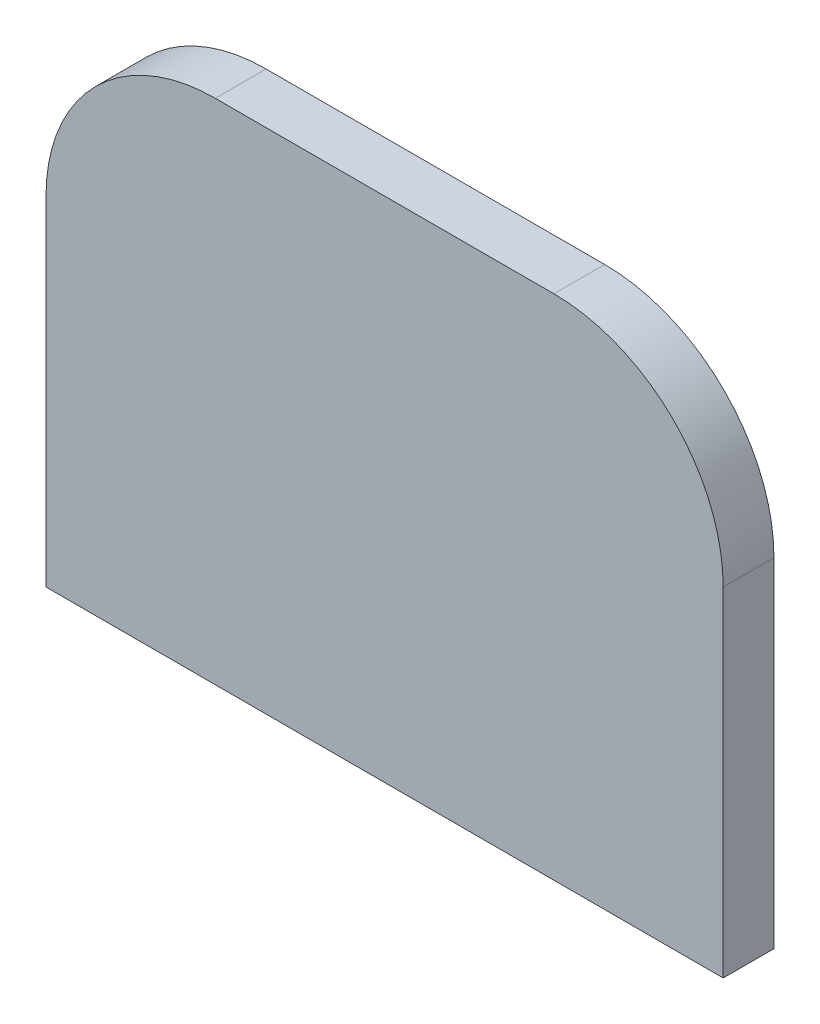
ISO-10303-21;
HEADER;
FILE_DESCRIPTION(('STEP AP214'),'2;1');
FILE_NAME('part.step','',(''),(''),'','','');
FILE_SCHEMA(('AUTOMOTIVE_DESIGN { 1 0 10303 214 1 1 1 1 }'));
ENDSEC;
DATA;
#1=APPLICATION_CONTEXT('core data for automotive mechanical design processes');
#2=APPLICATION_PROTOCOL_DEFINITION('international standard','automotive_design',2000,#1);
#3=PRODUCT_CONTEXT('',#1,'mechanical');
#4=PRODUCT('Part','Part','',(#3));
#5=PRODUCT_RELATED_PRODUCT_CATEGORY('part','',(#4));
#6=PRODUCT_DEFINITION_FORMATION('','',#4);
#7=PRODUCT_DEFINITION_CONTEXT('part definition',#1,'design');
#8=PRODUCT_DEFINITION('design','',#6,#7);
#9=PRODUCT_DEFINITION_SHAPE('','',#8);
#10=(LENGTH_UNIT() NAMED_UNIT(*) SI_UNIT(.MILLI.,.METRE.));
#11=(NAMED_UNIT(*) PLANE_ANGLE_UNIT() SI_UNIT($,.RADIAN.));
#12=(NAMED_UNIT(*) SI_UNIT($,.STERADIAN.) SOLID_ANGLE_UNIT());
#13=UNCERTAINTY_MEASURE_WITH_UNIT(LENGTH_MEASURE(1.E-05),#10,'distance_accuracy_value','');
#14=(GEOMETRIC_REPRESENTATION_CONTEXT(3) GLOBAL_UNCERTAINTY_ASSIGNED_CONTEXT((#13)) GLOBAL_UNIT_ASSIGNED_CONTEXT((#10,
#11,#12)) REPRESENTATION_CONTEXT('',''));
#15=CARTESIAN_POINT('',(0.,0.,0.));
#16=DIRECTION('',(0.,0.,1.));
#17=DIRECTION('',(1.,0.,0.));
#18=AXIS2_PLACEMENT_3D('',#15,#16,#17);
#19=CARTESIAN_POINT('',(20.,15.,3.));
#20=DIRECTION('',(-1.,0.,0.));
#21=DIRECTION('',(0.,0.,1.));
#22=AXIS2_PLACEMENT_3D('',#19,#20,#21);
#23=PLANE('',#22);
#24=DIRECTION('',(0.,1.,0.));
#25=VECTOR('',#24,1.);
#26=CARTESIAN_POINT('',(20.,15.,0.));
#27=LINE('',#26,#25);
#28=CARTESIAN_POINT('',(20.,-15.,0.));
#29=VERTEX_POINT('',#28);
#30=CARTESIAN_POINT('',(20.,5.,0.));
#31=VERTEX_POINT('',#30);
#32=EDGE_CURVE('E120',#29,#31,#27,.T.);
#33=ORIENTED_EDGE('',*,*,#32,.T.);
#34=DIRECTION('',(0.,0.,-1.));
#35=VECTOR('',#34,1.);
#36=CARTESIAN_POINT('',(20.,5.,3.));
#37=LINE('',#36,#35);
#38=CARTESIAN_POINT('',(20.,5.,3.));
#39=VERTEX_POINT('',#38);
#40=EDGE_CURVE('E64',#31,#39,#37,.F.);
#41=ORIENTED_EDGE('',*,*,#40,.T.);
#42=DIRECTION('',(0.,1.,0.));
#43=VECTOR('',#42,1.);
#44=CARTESIAN_POINT('',(20.,15.,3.));
#45=LINE('',#44,#43);
#46=CARTESIAN_POINT('',(20.,-15.,3.));
#47=VERTEX_POINT('',#46);
#48=EDGE_CURVE('E127',#47,#39,#45,.T.);
#49=ORIENTED_EDGE('',*,*,#48,.F.);
#50=DIRECTION('',(0.,0.,-1.));
#51=VECTOR('',#50,1.);
#52=CARTESIAN_POINT('',(20.,-15.,3.));
#53=LINE('',#52,#51);
#54=EDGE_CURVE('E112',#47,#29,#53,.T.);
#55=ORIENTED_EDGE('',*,*,#54,.T.);
#56=EDGE_LOOP('',(#33,#41,#49,#55));
#57=FACE_BOUND('',#56,.T.);
#58=ADVANCED_FACE('F41',(#57),#23,.F.);
#59=CARTESIAN_POINT('',(-20.,15.,3.));
#60=DIRECTION('',(0.,-1.,0.));
#61=DIRECTION('',(0.,0.,-1.));
#62=AXIS2_PLACEMENT_3D('',#59,#60,#61);
#63=PLANE('',#62);
#64=DIRECTION('',(-1.,0.,0.));
#65=VECTOR('',#64,1.);
#66=CARTESIAN_POINT('',(-20.,15.,3.));
#67=LINE('',#66,#65);
#68=CARTESIAN_POINT('',(10.,15.,3.));
#69=VERTEX_POINT('',#68);
#70=CARTESIAN_POINT('',(-10.,15.,3.));
#71=VERTEX_POINT('',#70);
#72=EDGE_CURVE('E102',#69,#71,#67,.T.);
#73=ORIENTED_EDGE('',*,*,#72,.F.);
#74=DIRECTION('',(0.,0.,-1.));
#75=VECTOR('',#74,1.);
#76=CARTESIAN_POINT('',(10.,15.,3.));
#77=LINE('',#76,#75);
#78=CARTESIAN_POINT('',(10.,15.,0.));
#79=VERTEX_POINT('',#78);
#80=EDGE_CURVE('E130',#69,#79,#77,.T.);
#81=ORIENTED_EDGE('',*,*,#80,.T.);
#82=DIRECTION('',(-1.,0.,0.));
#83=VECTOR('',#82,1.);
#84=CARTESIAN_POINT('',(-20.,15.,0.));
#85=LINE('',#84,#83);
#86=CARTESIAN_POINT('',(-10.,15.,0.));
#87=VERTEX_POINT('',#86);
#88=EDGE_CURVE('E122',#79,#87,#85,.T.);
#89=ORIENTED_EDGE('',*,*,#88,.T.);
#90=DIRECTION('',(0.,0.,-1.));
#91=VECTOR('',#90,1.);
#92=CARTESIAN_POINT('',(-10.,15.,3.));
#93=LINE('',#92,#91);
#94=EDGE_CURVE('E111',#87,#71,#93,.F.);
#95=ORIENTED_EDGE('',*,*,#94,.T.);
#96=EDGE_LOOP('',(#73,#81,#89,#95));
#97=FACE_BOUND('',#96,.T.);
#98=ADVANCED_FACE('F143',(#97),#63,.F.);
#99=CARTESIAN_POINT('',(-20.,15.,3.));
#100=DIRECTION('',(1.,0.,0.));
#101=DIRECTION('',(0.,1.,0.));
#102=AXIS2_PLACEMENT_3D('',#99,#100,#101);
#103=PLANE('',#102);
#104=DIRECTION('',(0.,-1.,0.));
#105=VECTOR('',#104,1.);
#106=CARTESIAN_POINT('',(-20.,15.,3.));
#107=LINE('',#106,#105);
#108=CARTESIAN_POINT('',(-20.,5.,3.));
#109=VERTEX_POINT('',#108);
#110=CARTESIAN_POINT('',(-20.,-15.,3.));
#111=VERTEX_POINT('',#110);
#112=EDGE_CURVE('E94',#109,#111,#107,.T.);
#113=ORIENTED_EDGE('',*,*,#112,.F.);
#114=DIRECTION('',(0.,0.,-1.));
#115=VECTOR('',#114,1.);
#116=CARTESIAN_POINT('',(-20.,5.,3.));
#117=LINE('',#116,#115);
#118=CARTESIAN_POINT('',(-20.,5.,0.));
#119=VERTEX_POINT('',#118);
#120=EDGE_CURVE('E11',#109,#119,#117,.T.);
#121=ORIENTED_EDGE('',*,*,#120,.T.);
#122=DIRECTION('',(0.,-1.,0.));
#123=VECTOR('',#122,1.);
#124=CARTESIAN_POINT('',(-20.,15.,0.));
#125=LINE('',#124,#123);
#126=CARTESIAN_POINT('',(-20.,-15.,0.));
#127=VERTEX_POINT('',#126);
#128=EDGE_CURVE('E108',#119,#127,#125,.T.);
#129=ORIENTED_EDGE('',*,*,#128,.T.);
#130=DIRECTION('',(0.,0.,-1.));
#131=VECTOR('',#130,1.);
#132=CARTESIAN_POINT('',(-20.,-15.,3.));
#133=LINE('',#132,#131);
#134=EDGE_CURVE('E105',#111,#127,#133,.T.);
#135=ORIENTED_EDGE('',*,*,#134,.F.);
#136=EDGE_LOOP('',(#113,#121,#129,#135));
#137=FACE_BOUND('',#136,.T.);
#138=ADVANCED_FACE('F106',(#137),#103,.F.);
#139=CARTESIAN_POINT('',(-20.,-15.,3.));
#140=DIRECTION('',(0.,1.,0.));
#141=DIRECTION('',(0.,0.,1.));
#142=AXIS2_PLACEMENT_3D('',#139,#140,#141);
#143=PLANE('',#142);
#144=DIRECTION('',(1.,0.,0.));
#145=VECTOR('',#144,1.);
#146=CARTESIAN_POINT('',(-20.,-15.,0.));
#147=LINE('',#146,#145);
#148=EDGE_CURVE('E126',#127,#29,#147,.T.);
#149=ORIENTED_EDGE('',*,*,#148,.T.);
#150=ORIENTED_EDGE('',*,*,#54,.F.);
#151=DIRECTION('',(1.,0.,0.));
#152=VECTOR('',#151,1.);
#153=CARTESIAN_POINT('',(-20.,-15.,3.));
#154=LINE('',#153,#152);
#155=EDGE_CURVE('E98',#111,#47,#154,.T.);
#156=ORIENTED_EDGE('',*,*,#155,.F.);
#157=ORIENTED_EDGE('',*,*,#134,.T.);
#158=EDGE_LOOP('',(#149,#150,#156,#157));
#159=FACE_BOUND('',#158,.T.);
#160=ADVANCED_FACE('F114',(#159),#143,.F.);
#161=CARTESIAN_POINT('',(0.,0.,3.));
#162=DIRECTION('',(0.,0.,1.));
#163=DIRECTION('',(1.,0.,0.));
#164=AXIS2_PLACEMENT_3D('',#161,#162,#163);
#165=PLANE('',#164);
#166=ORIENTED_EDGE('',*,*,#48,.T.);
#167=CARTESIAN_POINT('',(10.,5.,3.));
#168=DIRECTION('',(0.,0.,1.));
#169=DIRECTION('',(1.,0.,0.));
#170=AXIS2_PLACEMENT_3D('',#167,#168,#169);
#171=CIRCLE('',#170,10.);
#172=EDGE_CURVE('E49',#39,#69,#171,.T.);
#173=ORIENTED_EDGE('',*,*,#172,.T.);
#174=ORIENTED_EDGE('',*,*,#72,.T.);
#175=CARTESIAN_POINT('',(-10.,5.,3.));
#176=DIRECTION('',(0.,0.,1.));
#177=DIRECTION('',(1.,0.,0.));
#178=AXIS2_PLACEMENT_3D('',#175,#176,#177);
#179=CIRCLE('',#178,10.);
#180=EDGE_CURVE('E56',#71,#109,#179,.T.);
#181=ORIENTED_EDGE('',*,*,#180,.T.);
#182=ORIENTED_EDGE('',*,*,#112,.T.);
#183=ORIENTED_EDGE('',*,*,#155,.T.);
#184=EDGE_LOOP('',(#166,#173,#174,#181,#182,#183));
#185=FACE_BOUND('',#184,.T.);
#186=ADVANCED_FACE('F96',(#185),#165,.T.);
#187=CARTESIAN_POINT('',(0.,0.,0.));
#188=DIRECTION('',(0.,0.,1.));
#189=DIRECTION('',(1.,0.,0.));
#190=AXIS2_PLACEMENT_3D('',#187,#188,#189);
#191=PLANE('',#190);
#192=ORIENTED_EDGE('',*,*,#88,.F.);
#193=CARTESIAN_POINT('',(10.,5.,0.));
#194=DIRECTION('',(0.,0.,1.));
#195=DIRECTION('',(1.,0.,0.));
#196=AXIS2_PLACEMENT_3D('',#193,#194,#195);
#197=CIRCLE('',#196,10.);
#198=EDGE_CURVE('E135',#79,#31,#197,.F.);
#199=ORIENTED_EDGE('',*,*,#198,.T.);
#200=ORIENTED_EDGE('',*,*,#32,.F.);
#201=ORIENTED_EDGE('',*,*,#148,.F.);
#202=ORIENTED_EDGE('',*,*,#128,.F.);
#203=CARTESIAN_POINT('',(-10.,5.,0.));
#204=DIRECTION('',(0.,0.,1.));
#205=DIRECTION('',(1.,0.,0.));
#206=AXIS2_PLACEMENT_3D('',#203,#204,#205);
#207=CIRCLE('',#206,10.);
#208=EDGE_CURVE('E133',#119,#87,#207,.F.);
#209=ORIENTED_EDGE('',*,*,#208,.T.);
#210=EDGE_LOOP('',(#192,#199,#200,#201,#202,#209));
#211=FACE_BOUND('',#210,.T.);
#212=ADVANCED_FACE('F149',(#211),#191,.F.);
#213=CARTESIAN_POINT('',(10.,5.,3.));
#214=DIRECTION('',(0.,0.,-1.));
#215=DIRECTION('',(-1.,0.,0.));
#216=AXIS2_PLACEMENT_3D('',#213,#214,#215);
#217=CYLINDRICAL_SURFACE('',#216,10.);
#218=ORIENTED_EDGE('',*,*,#172,.F.);
#219=ORIENTED_EDGE('',*,*,#40,.F.);
#220=ORIENTED_EDGE('',*,*,#198,.F.);
#221=ORIENTED_EDGE('',*,*,#80,.F.);
#222=EDGE_LOOP('',(#218,#219,#220,#221));
#223=FACE_BOUND('',#222,.T.);
#224=ADVANCED_FACE('F146',(#223),#217,.T.);
#225=CARTESIAN_POINT('',(-10.,5.,3.));
#226=DIRECTION('',(0.,0.,-1.));
#227=DIRECTION('',(-1.,0.,0.));
#228=AXIS2_PLACEMENT_3D('',#225,#226,#227);
#229=CYLINDRICAL_SURFACE('',#228,10.);
#230=ORIENTED_EDGE('',*,*,#180,.F.);
#231=ORIENTED_EDGE('',*,*,#94,.F.);
#232=ORIENTED_EDGE('',*,*,#208,.F.);
#233=ORIENTED_EDGE('',*,*,#120,.F.);
#234=EDGE_LOOP('',(#230,#231,#232,#233));
#235=FACE_BOUND('',#234,.T.);
#236=ADVANCED_FACE('F43',(#235),#229,.T.);
#237=CLOSED_SHELL('',(#58,#98,#138,#160,#186,#212,#224,#236));
#238=MANIFOLD_SOLID_BREP('B2',#237);
#239=ADVANCED_BREP_SHAPE_REPRESENTATION('',(#18,#238),#14);
#240=SHAPE_DEFINITION_REPRESENTATION(#9,#239);
ENDSEC;
END-ISO-10303-21;
